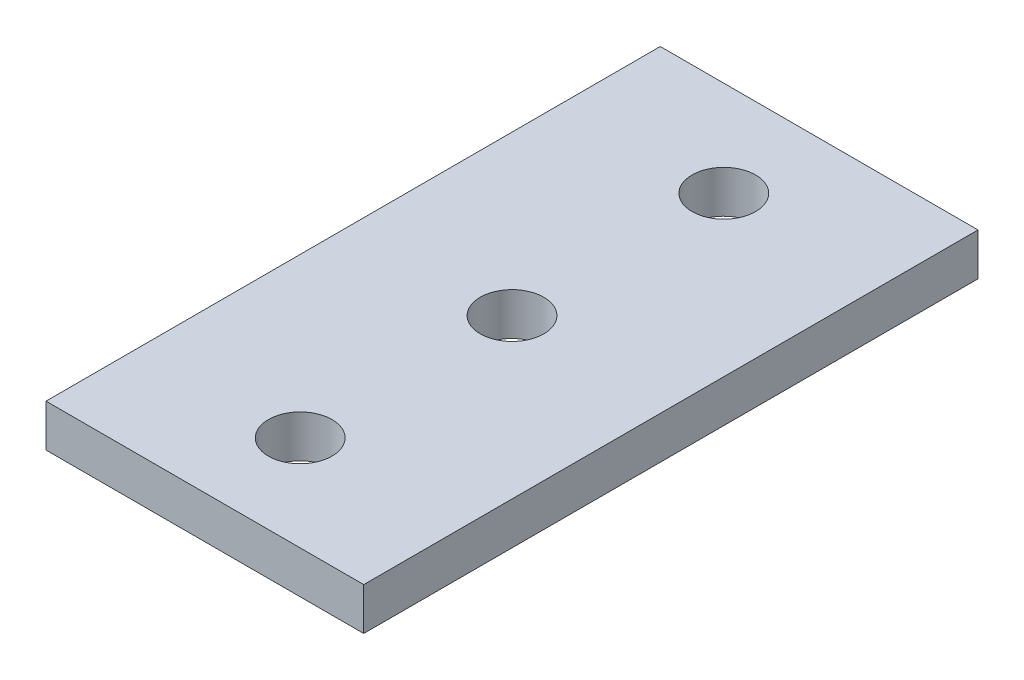
ISO-10303-21;
HEADER;
FILE_DESCRIPTION(('STEP AP214'),'2;1');
FILE_NAME('part.step','',(''),(''),'','','');
FILE_SCHEMA(('AUTOMOTIVE_DESIGN { 1 0 10303 214 1 1 1 1 }'));
ENDSEC;
DATA;
#1=APPLICATION_CONTEXT('core data for automotive mechanical design processes');
#2=APPLICATION_PROTOCOL_DEFINITION('international standard','automotive_design',2000,#1);
#3=PRODUCT_CONTEXT('',#1,'mechanical');
#4=PRODUCT('Part','Part','',(#3));
#5=PRODUCT_RELATED_PRODUCT_CATEGORY('part','',(#4));
#6=PRODUCT_DEFINITION_FORMATION('','',#4);
#7=PRODUCT_DEFINITION_CONTEXT('part definition',#1,'design');
#8=PRODUCT_DEFINITION('design','',#6,#7);
#9=PRODUCT_DEFINITION_SHAPE('','',#8);
#10=(LENGTH_UNIT() NAMED_UNIT(*) SI_UNIT(.MILLI.,.METRE.));
#11=(NAMED_UNIT(*) PLANE_ANGLE_UNIT() SI_UNIT($,.RADIAN.));
#12=(NAMED_UNIT(*) SI_UNIT($,.STERADIAN.) SOLID_ANGLE_UNIT());
#13=UNCERTAINTY_MEASURE_WITH_UNIT(LENGTH_MEASURE(1.E-05),#10,'distance_accuracy_value','');
#14=(GEOMETRIC_REPRESENTATION_CONTEXT(3) GLOBAL_UNCERTAINTY_ASSIGNED_CONTEXT((#13)) GLOBAL_UNIT_ASSIGNED_CONTEXT((#10,
#11,#12)) REPRESENTATION_CONTEXT('',''));
#15=CARTESIAN_POINT('',(0.,0.,0.));
#16=DIRECTION('',(0.,0.,1.));
#17=DIRECTION('',(1.,0.,0.));
#18=AXIS2_PLACEMENT_3D('',#15,#16,#17);
#19=CARTESIAN_POINT('',(0.,2.,0.));
#20=DIRECTION('',(0.,-1.,0.));
#21=DIRECTION('',(0.,0.,-1.));
#22=AXIS2_PLACEMENT_3D('',#19,#20,#21);
#23=PLANE('',#22);
#24=DIRECTION('',(0.,0.,1.));
#25=VECTOR('',#24,1.);
#26=CARTESIAN_POINT('',(0.,2.,0.));
#27=LINE('',#26,#25);
#28=CARTESIAN_POINT('',(0.,2.,-29.));
#29=VERTEX_POINT('',#28);
#30=CARTESIAN_POINT('',(0.,2.,0.));
#31=VERTEX_POINT('',#30);
#32=EDGE_CURVE('E85',#29,#31,#27,.T.);
#33=ORIENTED_EDGE('',*,*,#32,.T.);
#34=DIRECTION('',(1.,0.,0.));
#35=VECTOR('',#34,1.);
#36=CARTESIAN_POINT('',(0.,2.,0.));
#37=LINE('',#36,#35);
#38=CARTESIAN_POINT('',(15.,2.,0.));
#39=VERTEX_POINT('',#38);
#40=EDGE_CURVE('E80',#31,#39,#37,.T.);
#41=ORIENTED_EDGE('',*,*,#40,.T.);
#42=DIRECTION('',(0.,0.,-1.));
#43=VECTOR('',#42,1.);
#44=CARTESIAN_POINT('',(15.,2.,0.));
#45=LINE('',#44,#43);
#46=CARTESIAN_POINT('',(15.,2.,-29.));
#47=VERTEX_POINT('',#46);
#48=EDGE_CURVE('E83',#39,#47,#45,.T.);
#49=ORIENTED_EDGE('',*,*,#48,.T.);
#50=DIRECTION('',(-1.,0.,0.));
#51=VECTOR('',#50,1.);
#52=CARTESIAN_POINT('',(0.,2.,-29.));
#53=LINE('',#52,#51);
#54=EDGE_CURVE('E50',#47,#29,#53,.T.);
#55=ORIENTED_EDGE('',*,*,#54,.T.);
#56=EDGE_LOOP('',(#33,#41,#49,#55));
#57=FACE_BOUND('',#56,.T.);
#58=CARTESIAN_POINT('',(7.49999999999999,2.,-24.5));
#59=DIRECTION('',(0.,1.,0.));
#60=DIRECTION('',(0.,0.,1.));
#61=AXIS2_PLACEMENT_3D('',#58,#59,#60);
#62=CIRCLE('',#61,1.5);
#63=CARTESIAN_POINT('',(7.49999999999999,2.,-23.));
#64=VERTEX_POINT('',#63);
#65=EDGE_CURVE('E100',#64,#64,#62,.T.);
#66=ORIENTED_EDGE('',*,*,#65,.F.);
#67=EDGE_LOOP('',(#66));
#68=FACE_BOUND('',#67,.T.);
#69=CARTESIAN_POINT('',(7.49999999999999,2.,-14.5));
#70=DIRECTION('',(0.,1.,0.));
#71=DIRECTION('',(0.,0.,1.));
#72=AXIS2_PLACEMENT_3D('',#69,#70,#71);
#73=CIRCLE('',#72,1.5);
#74=CARTESIAN_POINT('',(7.49999999999999,2.,-13.));
#75=VERTEX_POINT('',#74);
#76=EDGE_CURVE('E115',#75,#75,#73,.T.);
#77=ORIENTED_EDGE('',*,*,#76,.F.);
#78=EDGE_LOOP('',(#77));
#79=FACE_BOUND('',#78,.T.);
#80=CARTESIAN_POINT('',(7.49999999999999,2.,-4.5));
#81=DIRECTION('',(0.,1.,0.));
#82=DIRECTION('',(0.,0.,1.));
#83=AXIS2_PLACEMENT_3D('',#80,#81,#82);
#84=CIRCLE('',#83,1.5);
#85=CARTESIAN_POINT('',(7.49999999999999,2.,-3.));
#86=VERTEX_POINT('',#85);
#87=EDGE_CURVE('E121',#86,#86,#84,.T.);
#88=ORIENTED_EDGE('',*,*,#87,.F.);
#89=EDGE_LOOP('',(#88));
#90=FACE_BOUND('',#89,.T.);
#91=ADVANCED_FACE('F33',(#57,#68,#79,#90),#23,.F.);
#92=CARTESIAN_POINT('',(0.,0.,0.));
#93=DIRECTION('',(0.,-1.,0.));
#94=DIRECTION('',(0.,0.,-1.));
#95=AXIS2_PLACEMENT_3D('',#92,#93,#94);
#96=PLANE('',#95);
#97=CARTESIAN_POINT('',(7.49999999999999,0.,-14.5));
#98=DIRECTION('',(0.,1.,0.));
#99=DIRECTION('',(0.,0.,1.));
#100=AXIS2_PLACEMENT_3D('',#97,#98,#99);
#101=CIRCLE('',#100,1.5);
#102=CARTESIAN_POINT('',(7.49999999999999,0.,-13.));
#103=VERTEX_POINT('',#102);
#104=EDGE_CURVE('E118',#103,#103,#101,.T.);
#105=ORIENTED_EDGE('',*,*,#104,.T.);
#106=EDGE_LOOP('',(#105));
#107=FACE_BOUND('',#106,.T.);
#108=DIRECTION('',(0.,0.,1.));
#109=VECTOR('',#108,1.);
#110=CARTESIAN_POINT('',(0.,0.,0.));
#111=LINE('',#110,#109);
#112=CARTESIAN_POINT('',(0.,0.,-29.));
#113=VERTEX_POINT('',#112);
#114=CARTESIAN_POINT('',(0.,0.,0.));
#115=VERTEX_POINT('',#114);
#116=EDGE_CURVE('E97',#113,#115,#111,.T.);
#117=ORIENTED_EDGE('',*,*,#116,.F.);
#118=DIRECTION('',(-1.,0.,0.));
#119=VECTOR('',#118,1.);
#120=CARTESIAN_POINT('',(0.,0.,-29.));
#121=LINE('',#120,#119);
#122=CARTESIAN_POINT('',(15.,0.,-29.));
#123=VERTEX_POINT('',#122);
#124=EDGE_CURVE('E73',#123,#113,#121,.T.);
#125=ORIENTED_EDGE('',*,*,#124,.F.);
#126=DIRECTION('',(0.,0.,-1.));
#127=VECTOR('',#126,1.);
#128=CARTESIAN_POINT('',(15.,0.,0.));
#129=LINE('',#128,#127);
#130=CARTESIAN_POINT('',(15.,0.,0.));
#131=VERTEX_POINT('',#130);
#132=EDGE_CURVE('E67',#131,#123,#129,.T.);
#133=ORIENTED_EDGE('',*,*,#132,.F.);
#134=DIRECTION('',(1.,0.,0.));
#135=VECTOR('',#134,1.);
#136=CARTESIAN_POINT('',(0.,0.,0.));
#137=LINE('',#136,#135);
#138=EDGE_CURVE('E89',#115,#131,#137,.T.);
#139=ORIENTED_EDGE('',*,*,#138,.F.);
#140=EDGE_LOOP('',(#117,#125,#133,#139));
#141=FACE_BOUND('',#140,.T.);
#142=CARTESIAN_POINT('',(7.49999999999999,0.,-24.5));
#143=DIRECTION('',(0.,1.,0.));
#144=DIRECTION('',(0.,0.,1.));
#145=AXIS2_PLACEMENT_3D('',#142,#143,#144);
#146=CIRCLE('',#145,1.5);
#147=CARTESIAN_POINT('',(7.49999999999999,0.,-23.));
#148=VERTEX_POINT('',#147);
#149=EDGE_CURVE('E112',#148,#148,#146,.T.);
#150=ORIENTED_EDGE('',*,*,#149,.T.);
#151=EDGE_LOOP('',(#150));
#152=FACE_BOUND('',#151,.T.);
#153=CARTESIAN_POINT('',(7.49999999999999,0.,-4.5));
#154=DIRECTION('',(0.,1.,0.));
#155=DIRECTION('',(0.,0.,1.));
#156=AXIS2_PLACEMENT_3D('',#153,#154,#155);
#157=CIRCLE('',#156,1.5);
#158=CARTESIAN_POINT('',(7.49999999999999,0.,-3.));
#159=VERTEX_POINT('',#158);
#160=EDGE_CURVE('E124',#159,#159,#157,.T.);
#161=ORIENTED_EDGE('',*,*,#160,.T.);
#162=EDGE_LOOP('',(#161));
#163=FACE_BOUND('',#162,.T.);
#164=ADVANCED_FACE('F108',(#107,#141,#152,#163),#96,.T.);
#165=CARTESIAN_POINT('',(0.,2.,0.));
#166=DIRECTION('',(1.,0.,0.));
#167=DIRECTION('',(0.,0.,-1.));
#168=AXIS2_PLACEMENT_3D('',#165,#166,#167);
#169=PLANE('',#168);
#170=ORIENTED_EDGE('',*,*,#116,.T.);
#171=DIRECTION('',(0.,-1.,0.));
#172=VECTOR('',#171,1.);
#173=CARTESIAN_POINT('',(0.,2.,0.));
#174=LINE('',#173,#172);
#175=EDGE_CURVE('E11',#31,#115,#174,.T.);
#176=ORIENTED_EDGE('',*,*,#175,.F.);
#177=ORIENTED_EDGE('',*,*,#32,.F.);
#178=DIRECTION('',(0.,-1.,0.));
#179=VECTOR('',#178,1.);
#180=CARTESIAN_POINT('',(0.,2.,-29.));
#181=LINE('',#180,#179);
#182=EDGE_CURVE('E93',#29,#113,#181,.T.);
#183=ORIENTED_EDGE('',*,*,#182,.T.);
#184=EDGE_LOOP('',(#170,#176,#177,#183));
#185=FACE_BOUND('',#184,.T.);
#186=ADVANCED_FACE('F35',(#185),#169,.F.);
#187=CARTESIAN_POINT('',(0.,2.,0.));
#188=DIRECTION('',(0.,0.,-1.));
#189=DIRECTION('',(-1.,0.,0.));
#190=AXIS2_PLACEMENT_3D('',#187,#188,#189);
#191=PLANE('',#190);
#192=ORIENTED_EDGE('',*,*,#138,.T.);
#193=DIRECTION('',(0.,-1.,0.));
#194=VECTOR('',#193,1.);
#195=CARTESIAN_POINT('',(15.,2.,0.));
#196=LINE('',#195,#194);
#197=EDGE_CURVE('E42',#39,#131,#196,.T.);
#198=ORIENTED_EDGE('',*,*,#197,.F.);
#199=ORIENTED_EDGE('',*,*,#40,.F.);
#200=ORIENTED_EDGE('',*,*,#175,.T.);
#201=EDGE_LOOP('',(#192,#198,#199,#200));
#202=FACE_BOUND('',#201,.T.);
#203=ADVANCED_FACE('F88',(#202),#191,.F.);
#204=CARTESIAN_POINT('',(15.,2.,0.));
#205=DIRECTION('',(-1.,0.,0.));
#206=DIRECTION('',(0.,0.,1.));
#207=AXIS2_PLACEMENT_3D('',#204,#205,#206);
#208=PLANE('',#207);
#209=ORIENTED_EDGE('',*,*,#132,.T.);
#210=DIRECTION('',(0.,-1.,0.));
#211=VECTOR('',#210,1.);
#212=CARTESIAN_POINT('',(15.,2.,-29.));
#213=LINE('',#212,#211);
#214=EDGE_CURVE('E90',#47,#123,#213,.T.);
#215=ORIENTED_EDGE('',*,*,#214,.F.);
#216=ORIENTED_EDGE('',*,*,#48,.F.);
#217=ORIENTED_EDGE('',*,*,#197,.T.);
#218=EDGE_LOOP('',(#209,#215,#216,#217));
#219=FACE_BOUND('',#218,.T.);
#220=ADVANCED_FACE('F91',(#219),#208,.F.);
#221=CARTESIAN_POINT('',(0.,2.,-29.));
#222=DIRECTION('',(0.,0.,1.));
#223=DIRECTION('',(1.,0.,0.));
#224=AXIS2_PLACEMENT_3D('',#221,#222,#223);
#225=PLANE('',#224);
#226=ORIENTED_EDGE('',*,*,#124,.T.);
#227=ORIENTED_EDGE('',*,*,#182,.F.);
#228=ORIENTED_EDGE('',*,*,#54,.F.);
#229=ORIENTED_EDGE('',*,*,#214,.T.);
#230=EDGE_LOOP('',(#226,#227,#228,#229));
#231=FACE_BOUND('',#230,.T.);
#232=ADVANCED_FACE('F105',(#231),#225,.F.);
#233=CARTESIAN_POINT('',(7.49999999999999,2.,-24.5));
#234=DIRECTION('',(0.,-1.,0.));
#235=DIRECTION('',(0.,0.,-1.));
#236=AXIS2_PLACEMENT_3D('',#233,#234,#235);
#237=CYLINDRICAL_SURFACE('',#236,1.5);
#238=ORIENTED_EDGE('',*,*,#65,.T.);
#239=EDGE_LOOP('',(#238));
#240=FACE_BOUND('',#239,.T.);
#241=ORIENTED_EDGE('',*,*,#149,.F.);
#242=EDGE_LOOP('',(#241));
#243=FACE_BOUND('',#242,.T.);
#244=ADVANCED_FACE('F141',(#240,#243),#237,.F.);
#245=CARTESIAN_POINT('',(7.49999999999999,2.,-14.5));
#246=DIRECTION('',(0.,-1.,0.));
#247=DIRECTION('',(0.,0.,-1.));
#248=AXIS2_PLACEMENT_3D('',#245,#246,#247);
#249=CYLINDRICAL_SURFACE('',#248,1.5);
#250=ORIENTED_EDGE('',*,*,#76,.T.);
#251=EDGE_LOOP('',(#250));
#252=FACE_BOUND('',#251,.T.);
#253=ORIENTED_EDGE('',*,*,#104,.F.);
#254=EDGE_LOOP('',(#253));
#255=FACE_BOUND('',#254,.T.);
#256=ADVANCED_FACE('F187',(#252,#255),#249,.F.);
#257=CARTESIAN_POINT('',(7.49999999999999,2.,-4.5));
#258=DIRECTION('',(0.,-1.,0.));
#259=DIRECTION('',(0.,0.,-1.));
#260=AXIS2_PLACEMENT_3D('',#257,#258,#259);
#261=CYLINDRICAL_SURFACE('',#260,1.5);
#262=ORIENTED_EDGE('',*,*,#87,.T.);
#263=EDGE_LOOP('',(#262));
#264=FACE_BOUND('',#263,.T.);
#265=ORIENTED_EDGE('',*,*,#160,.F.);
#266=EDGE_LOOP('',(#265));
#267=FACE_BOUND('',#266,.T.);
#268=ADVANCED_FACE('F130',(#264,#267),#261,.F.);
#269=CLOSED_SHELL('',(#91,#164,#186,#203,#220,#232,#244,#256,#268));
#270=MANIFOLD_SOLID_BREP('B2',#269);
#271=ADVANCED_BREP_SHAPE_REPRESENTATION('',(#18,#270),#14);
#272=SHAPE_DEFINITION_REPRESENTATION(#9,#271);
ENDSEC;
END-ISO-10303-21;
